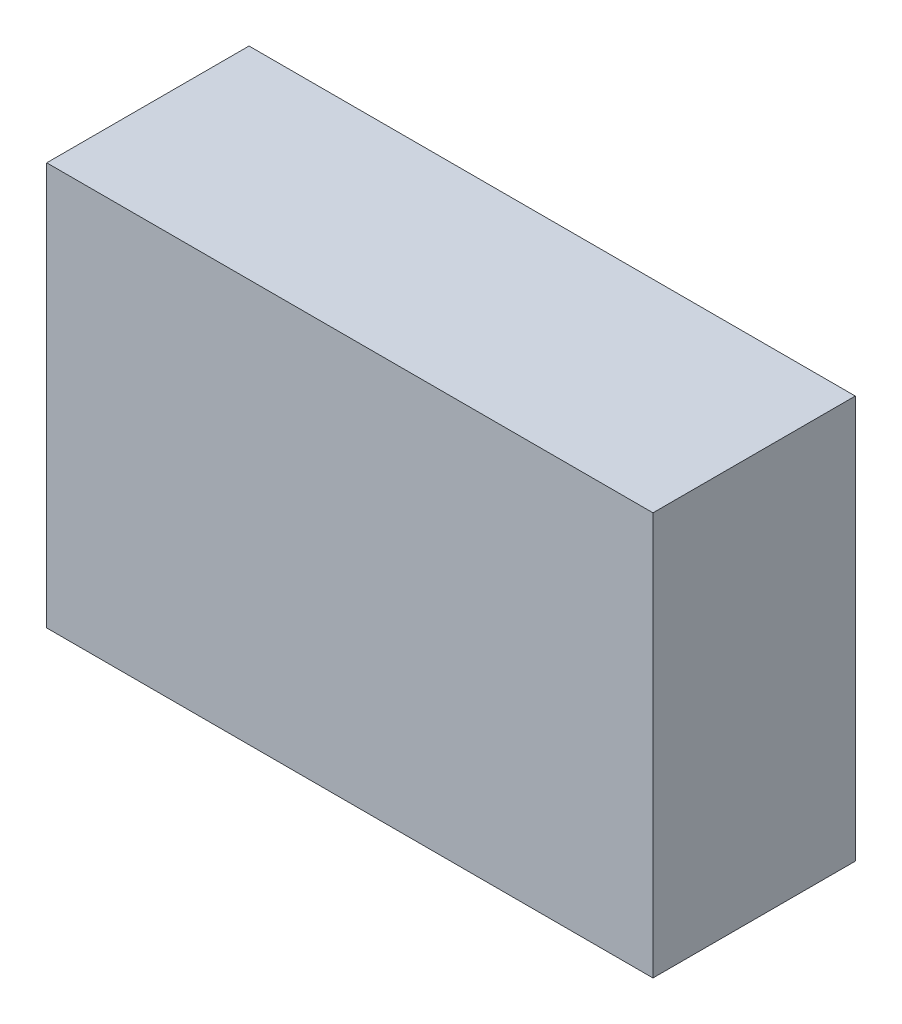
ISO-10303-21;
HEADER;
FILE_DESCRIPTION(('STEP AP214'),'2;1');
FILE_NAME('part.step','',(''),(''),'','','');
FILE_SCHEMA(('AUTOMOTIVE_DESIGN { 1 0 10303 214 1 1 1 1 }'));
ENDSEC;
DATA;
#1=APPLICATION_CONTEXT('core data for automotive mechanical design processes');
#2=APPLICATION_PROTOCOL_DEFINITION('international standard','automotive_design',2000,#1);
#3=PRODUCT_CONTEXT('',#1,'mechanical');
#4=PRODUCT('Part','Part','',(#3));
#5=PRODUCT_RELATED_PRODUCT_CATEGORY('part','',(#4));
#6=PRODUCT_DEFINITION_FORMATION('','',#4);
#7=PRODUCT_DEFINITION_CONTEXT('part definition',#1,'design');
#8=PRODUCT_DEFINITION('design','',#6,#7);
#9=PRODUCT_DEFINITION_SHAPE('','',#8);
#10=(LENGTH_UNIT() NAMED_UNIT(*) SI_UNIT(.MILLI.,.METRE.));
#11=(NAMED_UNIT(*) PLANE_ANGLE_UNIT() SI_UNIT($,.RADIAN.));
#12=(NAMED_UNIT(*) SI_UNIT($,.STERADIAN.) SOLID_ANGLE_UNIT());
#13=UNCERTAINTY_MEASURE_WITH_UNIT(LENGTH_MEASURE(1.E-05),#10,'distance_accuracy_value','');
#14=(GEOMETRIC_REPRESENTATION_CONTEXT(3) GLOBAL_UNCERTAINTY_ASSIGNED_CONTEXT((#13)) GLOBAL_UNIT_ASSIGNED_CONTEXT((#10,
#11,#12)) REPRESENTATION_CONTEXT('',''));
#15=CARTESIAN_POINT('',(0.,0.,0.));
#16=DIRECTION('',(0.,0.,1.));
#17=DIRECTION('',(1.,0.,0.));
#18=AXIS2_PLACEMENT_3D('',#15,#16,#17);
#19=CARTESIAN_POINT('',(-1.4984,-0.983,1.));
#20=DIRECTION('',(1.,0.,0.));
#21=DIRECTION('',(0.,0.,-1.));
#22=AXIS2_PLACEMENT_3D('',#19,#20,#21);
#23=PLANE('',#22);
#24=DIRECTION('',(0.,-1.,0.));
#25=VECTOR('',#24,1.);
#26=CARTESIAN_POINT('',(-1.4984,-0.983,0.));
#27=LINE('',#26,#25);
#28=CARTESIAN_POINT('',(-1.4984,1.0084,0.));
#29=VERTEX_POINT('',#28);
#30=CARTESIAN_POINT('',(-1.4984,-0.983,0.));
#31=VERTEX_POINT('',#30);
#32=EDGE_CURVE('E95',#29,#31,#27,.T.);
#33=ORIENTED_EDGE('',*,*,#32,.T.);
#34=DIRECTION('',(0.,0.,-1.));
#35=VECTOR('',#34,1.);
#36=CARTESIAN_POINT('',(-1.4984,-0.983,1.));
#37=LINE('',#36,#35);
#38=CARTESIAN_POINT('',(-1.4984,-0.983,1.));
#39=VERTEX_POINT('',#38);
#40=EDGE_CURVE('E11',#39,#31,#37,.T.);
#41=ORIENTED_EDGE('',*,*,#40,.F.);
#42=DIRECTION('',(0.,-1.,0.));
#43=VECTOR('',#42,1.);
#44=CARTESIAN_POINT('',(-1.4984,-0.983,1.));
#45=LINE('',#44,#43);
#46=CARTESIAN_POINT('',(-1.4984,1.0084,1.));
#47=VERTEX_POINT('',#46);
#48=EDGE_CURVE('E83',#47,#39,#45,.T.);
#49=ORIENTED_EDGE('',*,*,#48,.F.);
#50=DIRECTION('',(0.,0.,-1.));
#51=VECTOR('',#50,1.);
#52=CARTESIAN_POINT('',(-1.4984,1.0084,1.));
#53=LINE('',#52,#51);
#54=EDGE_CURVE('E91',#47,#29,#53,.T.);
#55=ORIENTED_EDGE('',*,*,#54,.T.);
#56=EDGE_LOOP('',(#33,#41,#49,#55));
#57=FACE_BOUND('',#56,.T.);
#58=ADVANCED_FACE('F32',(#57),#23,.F.);
#59=CARTESIAN_POINT('',(1.4984,-0.983,1.));
#60=DIRECTION('',(0.,1.,0.));
#61=DIRECTION('',(0.,0.,1.));
#62=AXIS2_PLACEMENT_3D('',#59,#60,#61);
#63=PLANE('',#62);
#64=DIRECTION('',(1.,0.,0.));
#65=VECTOR('',#64,1.);
#66=CARTESIAN_POINT('',(1.4984,-0.983,0.));
#67=LINE('',#66,#65);
#68=CARTESIAN_POINT('',(1.4984,-0.983,0.));
#69=VERTEX_POINT('',#68);
#70=EDGE_CURVE('E87',#31,#69,#67,.T.);
#71=ORIENTED_EDGE('',*,*,#70,.T.);
#72=DIRECTION('',(0.,0.,-1.));
#73=VECTOR('',#72,1.);
#74=CARTESIAN_POINT('',(1.4984,-0.983,1.));
#75=LINE('',#74,#73);
#76=CARTESIAN_POINT('',(1.4984,-0.983,1.));
#77=VERTEX_POINT('',#76);
#78=EDGE_CURVE('E40',#77,#69,#75,.T.);
#79=ORIENTED_EDGE('',*,*,#78,.F.);
#80=DIRECTION('',(1.,0.,0.));
#81=VECTOR('',#80,1.);
#82=CARTESIAN_POINT('',(1.4984,-0.983,1.));
#83=LINE('',#82,#81);
#84=EDGE_CURVE('E78',#39,#77,#83,.T.);
#85=ORIENTED_EDGE('',*,*,#84,.F.);
#86=ORIENTED_EDGE('',*,*,#40,.T.);
#87=EDGE_LOOP('',(#71,#79,#85,#86));
#88=FACE_BOUND('',#87,.T.);
#89=ADVANCED_FACE('F86',(#88),#63,.F.);
#90=CARTESIAN_POINT('',(1.4984,1.0084,1.));
#91=DIRECTION('',(-1.,0.,0.));
#92=DIRECTION('',(0.,0.,1.));
#93=AXIS2_PLACEMENT_3D('',#90,#91,#92);
#94=PLANE('',#93);
#95=DIRECTION('',(0.,1.,0.));
#96=VECTOR('',#95,1.);
#97=CARTESIAN_POINT('',(1.4984,1.0084,0.));
#98=LINE('',#97,#96);
#99=CARTESIAN_POINT('',(1.4984,1.0084,0.));
#100=VERTEX_POINT('',#99);
#101=EDGE_CURVE('E65',#69,#100,#98,.T.);
#102=ORIENTED_EDGE('',*,*,#101,.T.);
#103=DIRECTION('',(0.,0.,-1.));
#104=VECTOR('',#103,1.);
#105=CARTESIAN_POINT('',(1.4984,1.0084,1.));
#106=LINE('',#105,#104);
#107=CARTESIAN_POINT('',(1.4984,1.0084,1.));
#108=VERTEX_POINT('',#107);
#109=EDGE_CURVE('E88',#108,#100,#106,.T.);
#110=ORIENTED_EDGE('',*,*,#109,.F.);
#111=DIRECTION('',(0.,1.,0.));
#112=VECTOR('',#111,1.);
#113=CARTESIAN_POINT('',(1.4984,1.0084,1.));
#114=LINE('',#113,#112);
#115=EDGE_CURVE('E81',#77,#108,#114,.T.);
#116=ORIENTED_EDGE('',*,*,#115,.F.);
#117=ORIENTED_EDGE('',*,*,#78,.T.);
#118=EDGE_LOOP('',(#102,#110,#116,#117));
#119=FACE_BOUND('',#118,.T.);
#120=ADVANCED_FACE('F89',(#119),#94,.F.);
#121=CARTESIAN_POINT('',(-1.4984,1.0084,1.));
#122=DIRECTION('',(0.,-1.,0.));
#123=DIRECTION('',(0.,0.,-1.));
#124=AXIS2_PLACEMENT_3D('',#121,#122,#123);
#125=PLANE('',#124);
#126=DIRECTION('',(-1.,0.,0.));
#127=VECTOR('',#126,1.);
#128=CARTESIAN_POINT('',(-1.4984,1.0084,0.));
#129=LINE('',#128,#127);
#130=EDGE_CURVE('E71',#100,#29,#129,.T.);
#131=ORIENTED_EDGE('',*,*,#130,.T.);
#132=ORIENTED_EDGE('',*,*,#54,.F.);
#133=DIRECTION('',(-1.,0.,0.));
#134=VECTOR('',#133,1.);
#135=CARTESIAN_POINT('',(-1.4984,1.0084,1.));
#136=LINE('',#135,#134);
#137=EDGE_CURVE('E48',#108,#47,#136,.T.);
#138=ORIENTED_EDGE('',*,*,#137,.F.);
#139=ORIENTED_EDGE('',*,*,#109,.T.);
#140=EDGE_LOOP('',(#131,#132,#138,#139));
#141=FACE_BOUND('',#140,.T.);
#142=ADVANCED_FACE('F102',(#141),#125,.F.);
#143=CARTESIAN_POINT('',(0.,0.,1.));
#144=DIRECTION('',(0.,0.,-1.));
#145=DIRECTION('',(-1.,0.,0.));
#146=AXIS2_PLACEMENT_3D('',#143,#144,#145);
#147=PLANE('',#146);
#148=ORIENTED_EDGE('',*,*,#48,.T.);
#149=ORIENTED_EDGE('',*,*,#84,.T.);
#150=ORIENTED_EDGE('',*,*,#115,.T.);
#151=ORIENTED_EDGE('',*,*,#137,.T.);
#152=EDGE_LOOP('',(#148,#149,#150,#151));
#153=FACE_BOUND('',#152,.T.);
#154=ADVANCED_FACE('F79',(#153),#147,.F.);
#155=CARTESIAN_POINT('',(0.,0.,0.));
#156=DIRECTION('',(0.,0.,-1.));
#157=DIRECTION('',(-1.,0.,0.));
#158=AXIS2_PLACEMENT_3D('',#155,#156,#157);
#159=PLANE('',#158);
#160=ORIENTED_EDGE('',*,*,#32,.F.);
#161=ORIENTED_EDGE('',*,*,#130,.F.);
#162=ORIENTED_EDGE('',*,*,#101,.F.);
#163=ORIENTED_EDGE('',*,*,#70,.F.);
#164=EDGE_LOOP('',(#160,#161,#162,#163));
#165=FACE_BOUND('',#164,.T.);
#166=ADVANCED_FACE('F105',(#165),#159,.T.);
#167=CLOSED_SHELL('',(#58,#89,#120,#142,#154,#166));
#168=MANIFOLD_SOLID_BREP('B2',#167);
#169=ADVANCED_BREP_SHAPE_REPRESENTATION('',(#18,#168),#14);
#170=SHAPE_DEFINITION_REPRESENTATION(#9,#169);
ENDSEC;
END-ISO-10303-21;
